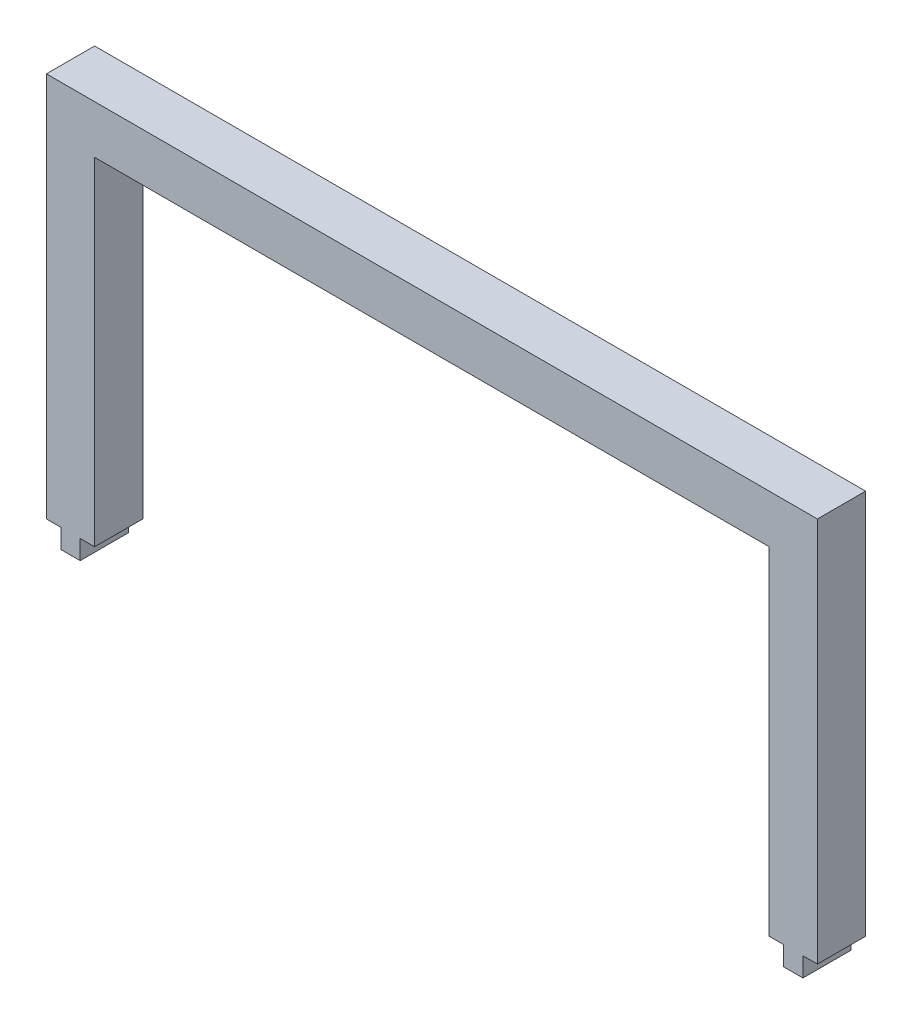
ISO-10303-21;
HEADER;
FILE_DESCRIPTION(('STEP AP214'),'2;1');
FILE_NAME('part.step','',(''),(''),'','','');
FILE_SCHEMA(('AUTOMOTIVE_DESIGN { 1 0 10303 214 1 1 1 1 }'));
ENDSEC;
DATA;
#1=APPLICATION_CONTEXT('core data for automotive mechanical design processes');
#2=APPLICATION_PROTOCOL_DEFINITION('international standard','automotive_design',2000,#1);
#3=PRODUCT_CONTEXT('',#1,'mechanical');
#4=PRODUCT('Part','Part','',(#3));
#5=PRODUCT_RELATED_PRODUCT_CATEGORY('part','',(#4));
#6=PRODUCT_DEFINITION_FORMATION('','',#4);
#7=PRODUCT_DEFINITION_CONTEXT('part definition',#1,'design');
#8=PRODUCT_DEFINITION('design','',#6,#7);
#9=PRODUCT_DEFINITION_SHAPE('','',#8);
#10=(LENGTH_UNIT() NAMED_UNIT(*) SI_UNIT(.MILLI.,.METRE.));
#11=(NAMED_UNIT(*) PLANE_ANGLE_UNIT() SI_UNIT($,.RADIAN.));
#12=(NAMED_UNIT(*) SI_UNIT($,.STERADIAN.) SOLID_ANGLE_UNIT());
#13=UNCERTAINTY_MEASURE_WITH_UNIT(LENGTH_MEASURE(1.E-05),#10,'distance_accuracy_value','');
#14=(GEOMETRIC_REPRESENTATION_CONTEXT(3) GLOBAL_UNCERTAINTY_ASSIGNED_CONTEXT((#13)) GLOBAL_UNIT_ASSIGNED_CONTEXT((#10,
#11,#12)) REPRESENTATION_CONTEXT('',''));
#15=CARTESIAN_POINT('',(0.,0.,0.));
#16=DIRECTION('',(0.,0.,1.));
#17=DIRECTION('',(1.,0.,0.));
#18=AXIS2_PLACEMENT_3D('',#15,#16,#17);
#19=CARTESIAN_POINT('',(247.133757961783,0.,50.));
#20=DIRECTION('',(-1.,0.,0.));
#21=DIRECTION('',(0.,0.,1.));
#22=AXIS2_PLACEMENT_3D('',#19,#20,#21);
#23=PLANE('',#22);
#24=DIRECTION('',(0.,1.,0.));
#25=VECTOR('',#24,1.);
#26=CARTESIAN_POINT('',(247.133757961783,0.,0.));
#27=LINE('',#26,#25);
#28=CARTESIAN_POINT('',(247.133757961783,-152.866242038217,0.));
#29=VERTEX_POINT('',#28);
#30=CARTESIAN_POINT('',(247.133757961783,197.133757961783,0.));
#31=VERTEX_POINT('',#30);
#32=EDGE_CURVE('E178',#29,#31,#27,.T.);
#33=ORIENTED_EDGE('',*,*,#32,.F.);
#34=DIRECTION('',(0.,0.,-1.));
#35=VECTOR('',#34,1.);
#36=CARTESIAN_POINT('',(247.133757961783,-152.866242038217,50.));
#37=LINE('',#36,#35);
#38=CARTESIAN_POINT('',(247.133757961783,-152.866242038217,50.));
#39=VERTEX_POINT('',#38);
#40=EDGE_CURVE('E11',#39,#29,#37,.T.);
#41=ORIENTED_EDGE('',*,*,#40,.F.);
#42=DIRECTION('',(0.,1.,0.));
#43=VECTOR('',#42,1.);
#44=CARTESIAN_POINT('',(247.133757961783,0.,50.));
#45=LINE('',#44,#43);
#46=CARTESIAN_POINT('',(247.133757961783,197.133757961783,50.));
#47=VERTEX_POINT('',#46);
#48=EDGE_CURVE('E212',#39,#47,#45,.T.);
#49=ORIENTED_EDGE('',*,*,#48,.T.);
#50=DIRECTION('',(0.,0.,-1.));
#51=VECTOR('',#50,1.);
#52=CARTESIAN_POINT('',(247.133757961783,197.133757961783,50.));
#53=LINE('',#52,#51);
#54=EDGE_CURVE('E110',#47,#31,#53,.T.);
#55=ORIENTED_EDGE('',*,*,#54,.T.);
#56=EDGE_LOOP('',(#33,#41,#49,#55));
#57=FACE_BOUND('',#56,.T.);
#58=ADVANCED_FACE('F35',(#57),#23,.T.);
#59=CARTESIAN_POINT('',(0.,-152.866242038217,50.));
#60=DIRECTION('',(0.,1.,0.));
#61=DIRECTION('',(0.,0.,1.));
#62=AXIS2_PLACEMENT_3D('',#59,#60,#61);
#63=PLANE('',#62);
#64=DIRECTION('',(1.,0.,0.));
#65=VECTOR('',#64,1.);
#66=CARTESIAN_POINT('',(0.,-152.866242038217,0.));
#67=LINE('',#66,#65);
#68=CARTESIAN_POINT('',(262.133757961783,-152.866242038217,0.));
#69=VERTEX_POINT('',#68);
#70=EDGE_CURVE('E181',#29,#69,#67,.T.);
#71=ORIENTED_EDGE('',*,*,#70,.T.);
#72=DIRECTION('',(0.,0.,-1.));
#73=VECTOR('',#72,1.);
#74=CARTESIAN_POINT('',(262.133757961783,-152.866242038217,50.));
#75=LINE('',#74,#73);
#76=CARTESIAN_POINT('',(262.133757961783,-152.866242038217,50.));
#77=VERTEX_POINT('',#76);
#78=EDGE_CURVE('E43',#77,#69,#75,.T.);
#79=ORIENTED_EDGE('',*,*,#78,.F.);
#80=DIRECTION('',(1.,0.,0.));
#81=VECTOR('',#80,1.);
#82=CARTESIAN_POINT('',(0.,-152.866242038217,50.));
#83=LINE('',#82,#81);
#84=EDGE_CURVE('E164',#39,#77,#83,.T.);
#85=ORIENTED_EDGE('',*,*,#84,.F.);
#86=ORIENTED_EDGE('',*,*,#40,.T.);
#87=EDGE_LOOP('',(#71,#79,#85,#86));
#88=FACE_BOUND('',#87,.T.);
#89=ADVANCED_FACE('F323',(#88),#63,.F.);
#90=CARTESIAN_POINT('',(262.133757961783,0.,50.));
#91=DIRECTION('',(1.,0.,0.));
#92=DIRECTION('',(0.,0.,-1.));
#93=AXIS2_PLACEMENT_3D('',#90,#91,#92);
#94=PLANE('',#93);
#95=DIRECTION('',(0.,-1.,0.));
#96=VECTOR('',#95,1.);
#97=CARTESIAN_POINT('',(262.133757961783,0.,0.));
#98=LINE('',#97,#96);
#99=CARTESIAN_POINT('',(262.133757961783,-172.866242038217,0.));
#100=VERTEX_POINT('',#99);
#101=EDGE_CURVE('E183',#69,#100,#98,.T.);
#102=ORIENTED_EDGE('',*,*,#101,.T.);
#103=DIRECTION('',(0.,0.,-1.));
#104=VECTOR('',#103,1.);
#105=CARTESIAN_POINT('',(262.133757961783,-172.866242038217,50.));
#106=LINE('',#105,#104);
#107=CARTESIAN_POINT('',(262.133757961783,-172.866242038217,50.));
#108=VERTEX_POINT('',#107);
#109=EDGE_CURVE('E237',#108,#100,#106,.T.);
#110=ORIENTED_EDGE('',*,*,#109,.F.);
#111=DIRECTION('',(0.,-1.,0.));
#112=VECTOR('',#111,1.);
#113=CARTESIAN_POINT('',(262.133757961783,0.,50.));
#114=LINE('',#113,#112);
#115=EDGE_CURVE('E246',#77,#108,#114,.T.);
#116=ORIENTED_EDGE('',*,*,#115,.F.);
#117=ORIENTED_EDGE('',*,*,#78,.T.);
#118=EDGE_LOOP('',(#102,#110,#116,#117));
#119=FACE_BOUND('',#118,.T.);
#120=ADVANCED_FACE('F244',(#119),#94,.F.);
#121=CARTESIAN_POINT('',(0.,-172.866242038217,50.));
#122=DIRECTION('',(0.,1.,0.));
#123=DIRECTION('',(0.,0.,1.));
#124=AXIS2_PLACEMENT_3D('',#121,#122,#123);
#125=PLANE('',#124);
#126=DIRECTION('',(1.,0.,0.));
#127=VECTOR('',#126,1.);
#128=CARTESIAN_POINT('',(0.,-172.866242038217,0.));
#129=LINE('',#128,#127);
#130=CARTESIAN_POINT('',(282.133757961783,-172.866242038217,0.));
#131=VERTEX_POINT('',#130);
#132=EDGE_CURVE('E186',#100,#131,#129,.T.);
#133=ORIENTED_EDGE('',*,*,#132,.T.);
#134=DIRECTION('',(0.,0.,-1.));
#135=VECTOR('',#134,1.);
#136=CARTESIAN_POINT('',(282.133757961783,-172.866242038217,50.));
#137=LINE('',#136,#135);
#138=CARTESIAN_POINT('',(282.133757961783,-172.866242038217,50.));
#139=VERTEX_POINT('',#138);
#140=EDGE_CURVE('E235',#139,#131,#137,.T.);
#141=ORIENTED_EDGE('',*,*,#140,.F.);
#142=DIRECTION('',(1.,0.,0.));
#143=VECTOR('',#142,1.);
#144=CARTESIAN_POINT('',(0.,-172.866242038217,50.));
#145=LINE('',#144,#143);
#146=EDGE_CURVE('E259',#108,#139,#145,.T.);
#147=ORIENTED_EDGE('',*,*,#146,.F.);
#148=ORIENTED_EDGE('',*,*,#109,.T.);
#149=EDGE_LOOP('',(#133,#141,#147,#148));
#150=FACE_BOUND('',#149,.T.);
#151=ADVANCED_FACE('F256',(#150),#125,.F.);
#152=CARTESIAN_POINT('',(282.133757961783,0.,50.));
#153=DIRECTION('',(1.,0.,0.));
#154=DIRECTION('',(0.,0.,-1.));
#155=AXIS2_PLACEMENT_3D('',#152,#153,#154);
#156=PLANE('',#155);
#157=DIRECTION('',(0.,-1.,0.));
#158=VECTOR('',#157,1.);
#159=CARTESIAN_POINT('',(282.133757961783,0.,0.));
#160=LINE('',#159,#158);
#161=CARTESIAN_POINT('',(282.133757961783,-152.866242038217,0.));
#162=VERTEX_POINT('',#161);
#163=EDGE_CURVE('E189',#162,#131,#160,.T.);
#164=ORIENTED_EDGE('',*,*,#163,.F.);
#165=DIRECTION('',(0.,0.,-1.));
#166=VECTOR('',#165,1.);
#167=CARTESIAN_POINT('',(282.133757961783,-152.866242038217,50.));
#168=LINE('',#167,#166);
#169=CARTESIAN_POINT('',(282.133757961783,-152.866242038217,50.));
#170=VERTEX_POINT('',#169);
#171=EDGE_CURVE('E233',#170,#162,#168,.T.);
#172=ORIENTED_EDGE('',*,*,#171,.F.);
#173=DIRECTION('',(0.,-1.,0.));
#174=VECTOR('',#173,1.);
#175=CARTESIAN_POINT('',(282.133757961783,0.,50.));
#176=LINE('',#175,#174);
#177=EDGE_CURVE('E261',#170,#139,#176,.T.);
#178=ORIENTED_EDGE('',*,*,#177,.T.);
#179=ORIENTED_EDGE('',*,*,#140,.T.);
#180=EDGE_LOOP('',(#164,#172,#178,#179));
#181=FACE_BOUND('',#180,.T.);
#182=ADVANCED_FACE('F349',(#181),#156,.T.);
#183=CARTESIAN_POINT('',(297.133757961783,-152.866242038217,0.));
#184=VERTEX_POINT('',#183);
#185=EDGE_CURVE('E184',#162,#184,#67,.T.);
#186=ORIENTED_EDGE('',*,*,#185,.T.);
#187=DIRECTION('',(0.,0.,-1.));
#188=VECTOR('',#187,1.);
#189=CARTESIAN_POINT('',(297.133757961783,-152.866242038217,50.));
#190=LINE('',#189,#188);
#191=CARTESIAN_POINT('',(297.133757961783,-152.866242038217,50.));
#192=VERTEX_POINT('',#191);
#193=EDGE_CURVE('E231',#192,#184,#190,.T.);
#194=ORIENTED_EDGE('',*,*,#193,.F.);
#195=EDGE_CURVE('E263',#170,#192,#83,.T.);
#196=ORIENTED_EDGE('',*,*,#195,.F.);
#197=ORIENTED_EDGE('',*,*,#171,.T.);
#198=EDGE_LOOP('',(#186,#194,#196,#197));
#199=FACE_BOUND('',#198,.T.);
#200=ADVANCED_FACE('F290',(#199),#63,.F.);
#201=CARTESIAN_POINT('',(297.133757961783,0.,50.));
#202=DIRECTION('',(1.,0.,0.));
#203=DIRECTION('',(0.,1.,0.));
#204=AXIS2_PLACEMENT_3D('',#201,#202,#203);
#205=PLANE('',#204);
#206=DIRECTION('',(0.,-1.,0.));
#207=VECTOR('',#206,1.);
#208=CARTESIAN_POINT('',(297.133757961783,0.,0.));
#209=LINE('',#208,#207);
#210=CARTESIAN_POINT('',(297.133757961783,247.133757961783,0.));
#211=VERTEX_POINT('',#210);
#212=EDGE_CURVE('E192',#211,#184,#209,.T.);
#213=ORIENTED_EDGE('',*,*,#212,.F.);
#214=DIRECTION('',(0.,0.,-1.));
#215=VECTOR('',#214,1.);
#216=CARTESIAN_POINT('',(297.133757961783,247.133757961783,50.));
#217=LINE('',#216,#215);
#218=CARTESIAN_POINT('',(297.133757961783,247.133757961783,50.));
#219=VERTEX_POINT('',#218);
#220=EDGE_CURVE('E229',#219,#211,#217,.T.);
#221=ORIENTED_EDGE('',*,*,#220,.F.);
#222=DIRECTION('',(0.,-1.,0.));
#223=VECTOR('',#222,1.);
#224=CARTESIAN_POINT('',(297.133757961783,0.,50.));
#225=LINE('',#224,#223);
#226=EDGE_CURVE('E267',#219,#192,#225,.T.);
#227=ORIENTED_EDGE('',*,*,#226,.T.);
#228=ORIENTED_EDGE('',*,*,#193,.T.);
#229=EDGE_LOOP('',(#213,#221,#227,#228));
#230=FACE_BOUND('',#229,.T.);
#231=ADVANCED_FACE('F296',(#230),#205,.T.);
#232=CARTESIAN_POINT('',(0.,247.133757961783,50.));
#233=DIRECTION('',(0.,1.,0.));
#234=DIRECTION('',(0.,0.,1.));
#235=AXIS2_PLACEMENT_3D('',#232,#233,#234);
#236=PLANE('',#235);
#237=DIRECTION('',(1.,0.,0.));
#238=VECTOR('',#237,1.);
#239=CARTESIAN_POINT('',(0.,247.133757961783,0.));
#240=LINE('',#239,#238);
#241=CARTESIAN_POINT('',(-502.866242038217,247.133757961783,0.));
#242=VERTEX_POINT('',#241);
#243=EDGE_CURVE('E195',#242,#211,#240,.T.);
#244=ORIENTED_EDGE('',*,*,#243,.F.);
#245=DIRECTION('',(0.,0.,-1.));
#246=VECTOR('',#245,1.);
#247=CARTESIAN_POINT('',(-502.866242038217,247.133757961783,50.));
#248=LINE('',#247,#246);
#249=CARTESIAN_POINT('',(-502.866242038217,247.133757961783,50.));
#250=VERTEX_POINT('',#249);
#251=EDGE_CURVE('E227',#250,#242,#248,.T.);
#252=ORIENTED_EDGE('',*,*,#251,.F.);
#253=DIRECTION('',(1.,0.,0.));
#254=VECTOR('',#253,1.);
#255=CARTESIAN_POINT('',(0.,247.133757961783,50.));
#256=LINE('',#255,#254);
#257=EDGE_CURVE('E270',#250,#219,#256,.T.);
#258=ORIENTED_EDGE('',*,*,#257,.T.);
#259=ORIENTED_EDGE('',*,*,#220,.T.);
#260=EDGE_LOOP('',(#244,#252,#258,#259));
#261=FACE_BOUND('',#260,.T.);
#262=ADVANCED_FACE('F300',(#261),#236,.T.);
#263=CARTESIAN_POINT('',(-502.866242038217,-1.39573420054389E-13,50.));
#264=DIRECTION('',(1.,0.,0.));
#265=DIRECTION('',(0.,1.,0.));
#266=AXIS2_PLACEMENT_3D('',#263,#264,#265);
#267=PLANE('',#266);
#268=DIRECTION('',(0.,-1.,0.));
#269=VECTOR('',#268,1.);
#270=CARTESIAN_POINT('',(-502.866242038217,-1.39573420054389E-13,0.));
#271=LINE('',#270,#269);
#272=CARTESIAN_POINT('',(-502.866242038217,-152.866242038217,0.));
#273=VERTEX_POINT('',#272);
#274=EDGE_CURVE('E198',#242,#273,#271,.T.);
#275=ORIENTED_EDGE('',*,*,#274,.T.);
#276=DIRECTION('',(0.,0.,-1.));
#277=VECTOR('',#276,1.);
#278=CARTESIAN_POINT('',(-502.866242038217,-152.866242038217,50.));
#279=LINE('',#278,#277);
#280=CARTESIAN_POINT('',(-502.866242038217,-152.866242038217,50.));
#281=VERTEX_POINT('',#280);
#282=EDGE_CURVE('E224',#281,#273,#279,.T.);
#283=ORIENTED_EDGE('',*,*,#282,.F.);
#284=DIRECTION('',(0.,-1.,0.));
#285=VECTOR('',#284,1.);
#286=CARTESIAN_POINT('',(-502.866242038217,-1.39573420054389E-13,50.));
#287=LINE('',#286,#285);
#288=EDGE_CURVE('E273',#250,#281,#287,.T.);
#289=ORIENTED_EDGE('',*,*,#288,.F.);
#290=ORIENTED_EDGE('',*,*,#251,.T.);
#291=EDGE_LOOP('',(#275,#283,#289,#290));
#292=FACE_BOUND('',#291,.T.);
#293=ADVANCED_FACE('F304',(#292),#267,.F.);
#294=CARTESIAN_POINT('',(-487.866242038217,-152.866242038217,0.));
#295=VERTEX_POINT('',#294);
#296=EDGE_CURVE('E200',#273,#295,#67,.T.);
#297=ORIENTED_EDGE('',*,*,#296,.T.);
#298=DIRECTION('',(0.,0.,-1.));
#299=VECTOR('',#298,1.);
#300=CARTESIAN_POINT('',(-487.866242038217,-152.866242038217,50.));
#301=LINE('',#300,#299);
#302=CARTESIAN_POINT('',(-487.866242038217,-152.866242038217,50.));
#303=VERTEX_POINT('',#302);
#304=EDGE_CURVE('E221',#303,#295,#301,.T.);
#305=ORIENTED_EDGE('',*,*,#304,.F.);
#306=EDGE_CURVE('E163',#281,#303,#83,.T.);
#307=ORIENTED_EDGE('',*,*,#306,.F.);
#308=ORIENTED_EDGE('',*,*,#282,.T.);
#309=EDGE_LOOP('',(#297,#305,#307,#308));
#310=FACE_BOUND('',#309,.T.);
#311=ADVANCED_FACE('F308',(#310),#63,.F.);
#312=CARTESIAN_POINT('',(-487.866242038217,0.,50.));
#313=DIRECTION('',(1.,0.,0.));
#314=DIRECTION('',(0.,0.,-1.));
#315=AXIS2_PLACEMENT_3D('',#312,#313,#314);
#316=PLANE('',#315);
#317=DIRECTION('',(0.,-1.,0.));
#318=VECTOR('',#317,1.);
#319=CARTESIAN_POINT('',(-487.866242038217,0.,0.));
#320=LINE('',#319,#318);
#321=CARTESIAN_POINT('',(-487.866242038217,-172.866242038217,0.));
#322=VERTEX_POINT('',#321);
#323=EDGE_CURVE('E201',#295,#322,#320,.T.);
#324=ORIENTED_EDGE('',*,*,#323,.T.);
#325=DIRECTION('',(0.,0.,-1.));
#326=VECTOR('',#325,1.);
#327=CARTESIAN_POINT('',(-487.866242038217,-172.866242038217,50.));
#328=LINE('',#327,#326);
#329=CARTESIAN_POINT('',(-487.866242038217,-172.866242038217,50.));
#330=VERTEX_POINT('',#329);
#331=EDGE_CURVE('E218',#330,#322,#328,.T.);
#332=ORIENTED_EDGE('',*,*,#331,.F.);
#333=DIRECTION('',(0.,-1.,0.));
#334=VECTOR('',#333,1.);
#335=CARTESIAN_POINT('',(-487.866242038217,0.,50.));
#336=LINE('',#335,#334);
#337=EDGE_CURVE('E275',#303,#330,#336,.T.);
#338=ORIENTED_EDGE('',*,*,#337,.F.);
#339=ORIENTED_EDGE('',*,*,#304,.T.);
#340=EDGE_LOOP('',(#324,#332,#338,#339));
#341=FACE_BOUND('',#340,.T.);
#342=ADVANCED_FACE('F311',(#341),#316,.F.);
#343=CARTESIAN_POINT('',(0.,-172.866242038217,50.));
#344=DIRECTION('',(0.,1.,0.));
#345=DIRECTION('',(0.,0.,1.));
#346=AXIS2_PLACEMENT_3D('',#343,#344,#345);
#347=PLANE('',#346);
#348=DIRECTION('',(1.,0.,0.));
#349=VECTOR('',#348,1.);
#350=CARTESIAN_POINT('',(0.,-172.866242038217,0.));
#351=LINE('',#350,#349);
#352=CARTESIAN_POINT('',(-467.866242038217,-172.866242038217,0.));
#353=VERTEX_POINT('',#352);
#354=EDGE_CURVE('E203',#322,#353,#351,.T.);
#355=ORIENTED_EDGE('',*,*,#354,.T.);
#356=DIRECTION('',(0.,0.,-1.));
#357=VECTOR('',#356,1.);
#358=CARTESIAN_POINT('',(-467.866242038217,-172.866242038217,50.));
#359=LINE('',#358,#357);
#360=CARTESIAN_POINT('',(-467.866242038217,-172.866242038217,50.));
#361=VERTEX_POINT('',#360);
#362=EDGE_CURVE('E216',#361,#353,#359,.T.);
#363=ORIENTED_EDGE('',*,*,#362,.F.);
#364=DIRECTION('',(1.,0.,0.));
#365=VECTOR('',#364,1.);
#366=CARTESIAN_POINT('',(0.,-172.866242038217,50.));
#367=LINE('',#366,#365);
#368=EDGE_CURVE('E276',#330,#361,#367,.T.);
#369=ORIENTED_EDGE('',*,*,#368,.F.);
#370=ORIENTED_EDGE('',*,*,#331,.T.);
#371=EDGE_LOOP('',(#355,#363,#369,#370));
#372=FACE_BOUND('',#371,.T.);
#373=ADVANCED_FACE('F313',(#372),#347,.F.);
#374=CARTESIAN_POINT('',(-467.866242038217,0.,50.));
#375=DIRECTION('',(1.,0.,0.));
#376=DIRECTION('',(0.,0.,-1.));
#377=AXIS2_PLACEMENT_3D('',#374,#375,#376);
#378=PLANE('',#377);
#379=DIRECTION('',(0.,-1.,0.));
#380=VECTOR('',#379,1.);
#381=CARTESIAN_POINT('',(-467.866242038217,0.,0.));
#382=LINE('',#381,#380);
#383=CARTESIAN_POINT('',(-467.866242038217,-152.866242038217,0.));
#384=VERTEX_POINT('',#383);
#385=EDGE_CURVE('E206',#384,#353,#382,.T.);
#386=ORIENTED_EDGE('',*,*,#385,.F.);
#387=DIRECTION('',(0.,0.,-1.));
#388=VECTOR('',#387,1.);
#389=CARTESIAN_POINT('',(-467.866242038217,-152.866242038217,50.));
#390=LINE('',#389,#388);
#391=CARTESIAN_POINT('',(-467.866242038217,-152.866242038217,50.));
#392=VERTEX_POINT('',#391);
#393=EDGE_CURVE('E169',#392,#384,#390,.T.);
#394=ORIENTED_EDGE('',*,*,#393,.F.);
#395=DIRECTION('',(0.,-1.,0.));
#396=VECTOR('',#395,1.);
#397=CARTESIAN_POINT('',(-467.866242038217,0.,50.));
#398=LINE('',#397,#396);
#399=EDGE_CURVE('E160',#392,#361,#398,.T.);
#400=ORIENTED_EDGE('',*,*,#399,.T.);
#401=ORIENTED_EDGE('',*,*,#362,.T.);
#402=EDGE_LOOP('',(#386,#394,#400,#401));
#403=FACE_BOUND('',#402,.T.);
#404=ADVANCED_FACE('F281',(#403),#378,.T.);
#405=CARTESIAN_POINT('',(-452.866242038217,-152.866242038217,0.));
#406=VERTEX_POINT('',#405);
#407=EDGE_CURVE('E168',#384,#406,#67,.T.);
#408=ORIENTED_EDGE('',*,*,#407,.T.);
#409=DIRECTION('',(0.,0.,-1.));
#410=VECTOR('',#409,1.);
#411=CARTESIAN_POINT('',(-452.866242038217,-152.866242038217,50.));
#412=LINE('',#411,#410);
#413=CARTESIAN_POINT('',(-452.866242038217,-152.866242038217,50.));
#414=VERTEX_POINT('',#413);
#415=EDGE_CURVE('E165',#414,#406,#412,.T.);
#416=ORIENTED_EDGE('',*,*,#415,.F.);
#417=EDGE_CURVE('E154',#392,#414,#83,.T.);
#418=ORIENTED_EDGE('',*,*,#417,.F.);
#419=ORIENTED_EDGE('',*,*,#393,.T.);
#420=EDGE_LOOP('',(#408,#416,#418,#419));
#421=FACE_BOUND('',#420,.T.);
#422=ADVANCED_FACE('F166',(#421),#63,.F.);
#423=CARTESIAN_POINT('',(-452.866242038217,0.,50.));
#424=DIRECTION('',(-1.,0.,0.));
#425=DIRECTION('',(0.,0.,1.));
#426=AXIS2_PLACEMENT_3D('',#423,#424,#425);
#427=PLANE('',#426);
#428=DIRECTION('',(0.,1.,0.));
#429=VECTOR('',#428,1.);
#430=CARTESIAN_POINT('',(-452.866242038217,0.,0.));
#431=LINE('',#430,#429);
#432=CARTESIAN_POINT('',(-452.866242038217,197.133757961783,0.));
#433=VERTEX_POINT('',#432);
#434=EDGE_CURVE('E103',#406,#433,#431,.T.);
#435=ORIENTED_EDGE('',*,*,#434,.T.);
#436=DIRECTION('',(0.,0.,-1.));
#437=VECTOR('',#436,1.);
#438=CARTESIAN_POINT('',(-452.866242038217,197.133757961783,50.));
#439=LINE('',#438,#437);
#440=CARTESIAN_POINT('',(-452.866242038217,197.133757961783,50.));
#441=VERTEX_POINT('',#440);
#442=EDGE_CURVE('E170',#441,#433,#439,.T.);
#443=ORIENTED_EDGE('',*,*,#442,.F.);
#444=DIRECTION('',(0.,1.,0.));
#445=VECTOR('',#444,1.);
#446=CARTESIAN_POINT('',(-452.866242038217,0.,50.));
#447=LINE('',#446,#445);
#448=EDGE_CURVE('E158',#414,#441,#447,.T.);
#449=ORIENTED_EDGE('',*,*,#448,.F.);
#450=ORIENTED_EDGE('',*,*,#415,.T.);
#451=EDGE_LOOP('',(#435,#443,#449,#450));
#452=FACE_BOUND('',#451,.T.);
#453=ADVANCED_FACE('F172',(#452),#427,.F.);
#454=CARTESIAN_POINT('',(0.,197.133757961783,50.));
#455=DIRECTION('',(0.,1.,0.));
#456=DIRECTION('',(0.,0.,1.));
#457=AXIS2_PLACEMENT_3D('',#454,#455,#456);
#458=PLANE('',#457);
#459=DIRECTION('',(1.,0.,0.));
#460=VECTOR('',#459,1.);
#461=CARTESIAN_POINT('',(0.,197.133757961783,0.));
#462=LINE('',#461,#460);
#463=EDGE_CURVE('E210',#433,#31,#462,.T.);
#464=ORIENTED_EDGE('',*,*,#463,.T.);
#465=ORIENTED_EDGE('',*,*,#54,.F.);
#466=DIRECTION('',(1.,0.,0.));
#467=VECTOR('',#466,1.);
#468=CARTESIAN_POINT('',(0.,197.133757961783,50.));
#469=LINE('',#468,#467);
#470=EDGE_CURVE('E51',#441,#47,#469,.T.);
#471=ORIENTED_EDGE('',*,*,#470,.F.);
#472=ORIENTED_EDGE('',*,*,#442,.T.);
#473=EDGE_LOOP('',(#464,#465,#471,#472));
#474=FACE_BOUND('',#473,.T.);
#475=ADVANCED_FACE('F329',(#474),#458,.F.);
#476=CARTESIAN_POINT('',(0.,0.,50.));
#477=DIRECTION('',(0.,0.,1.));
#478=DIRECTION('',(1.,0.,0.));
#479=AXIS2_PLACEMENT_3D('',#476,#477,#478);
#480=PLANE('',#479);
#481=ORIENTED_EDGE('',*,*,#48,.F.);
#482=ORIENTED_EDGE('',*,*,#84,.T.);
#483=ORIENTED_EDGE('',*,*,#115,.T.);
#484=ORIENTED_EDGE('',*,*,#146,.T.);
#485=ORIENTED_EDGE('',*,*,#177,.F.);
#486=ORIENTED_EDGE('',*,*,#195,.T.);
#487=ORIENTED_EDGE('',*,*,#226,.F.);
#488=ORIENTED_EDGE('',*,*,#257,.F.);
#489=ORIENTED_EDGE('',*,*,#288,.T.);
#490=ORIENTED_EDGE('',*,*,#306,.T.);
#491=ORIENTED_EDGE('',*,*,#337,.T.);
#492=ORIENTED_EDGE('',*,*,#368,.T.);
#493=ORIENTED_EDGE('',*,*,#399,.F.);
#494=ORIENTED_EDGE('',*,*,#417,.T.);
#495=ORIENTED_EDGE('',*,*,#448,.T.);
#496=ORIENTED_EDGE('',*,*,#470,.T.);
#497=EDGE_LOOP('',(#481,#482,#483,#484,#485,#486,#487,#488,#489,#490,#491,#492,#493,#494,#495,#496));
#498=FACE_BOUND('',#497,.T.);
#499=ADVANCED_FACE('F156',(#498),#480,.T.);
#500=CARTESIAN_POINT('',(0.,0.,0.));
#501=DIRECTION('',(0.,0.,1.));
#502=DIRECTION('',(1.,0.,0.));
#503=AXIS2_PLACEMENT_3D('',#500,#501,#502);
#504=PLANE('',#503);
#505=ORIENTED_EDGE('',*,*,#32,.T.);
#506=ORIENTED_EDGE('',*,*,#463,.F.);
#507=ORIENTED_EDGE('',*,*,#434,.F.);
#508=ORIENTED_EDGE('',*,*,#407,.F.);
#509=ORIENTED_EDGE('',*,*,#385,.T.);
#510=ORIENTED_EDGE('',*,*,#354,.F.);
#511=ORIENTED_EDGE('',*,*,#323,.F.);
#512=ORIENTED_EDGE('',*,*,#296,.F.);
#513=ORIENTED_EDGE('',*,*,#274,.F.);
#514=ORIENTED_EDGE('',*,*,#243,.T.);
#515=ORIENTED_EDGE('',*,*,#212,.T.);
#516=ORIENTED_EDGE('',*,*,#185,.F.);
#517=ORIENTED_EDGE('',*,*,#163,.T.);
#518=ORIENTED_EDGE('',*,*,#132,.F.);
#519=ORIENTED_EDGE('',*,*,#101,.F.);
#520=ORIENTED_EDGE('',*,*,#70,.F.);
#521=EDGE_LOOP('',(#505,#506,#507,#508,#509,#510,#511,#512,#513,#514,#515,#516,#517,#518,#519,#520));
#522=FACE_BOUND('',#521,.T.);
#523=ADVANCED_FACE('F251',(#522),#504,.F.);
#524=CLOSED_SHELL('',(#58,#89,#120,#151,#182,#200,#231,#262,#293,#311,#342,#373,#404,#422,#453,
#475,#499,#523));
#525=MANIFOLD_SOLID_BREP('B2',#524);
#526=ADVANCED_BREP_SHAPE_REPRESENTATION('',(#18,#525),#14);
#527=SHAPE_DEFINITION_REPRESENTATION(#9,#526);
ENDSEC;
END-ISO-10303-21;
